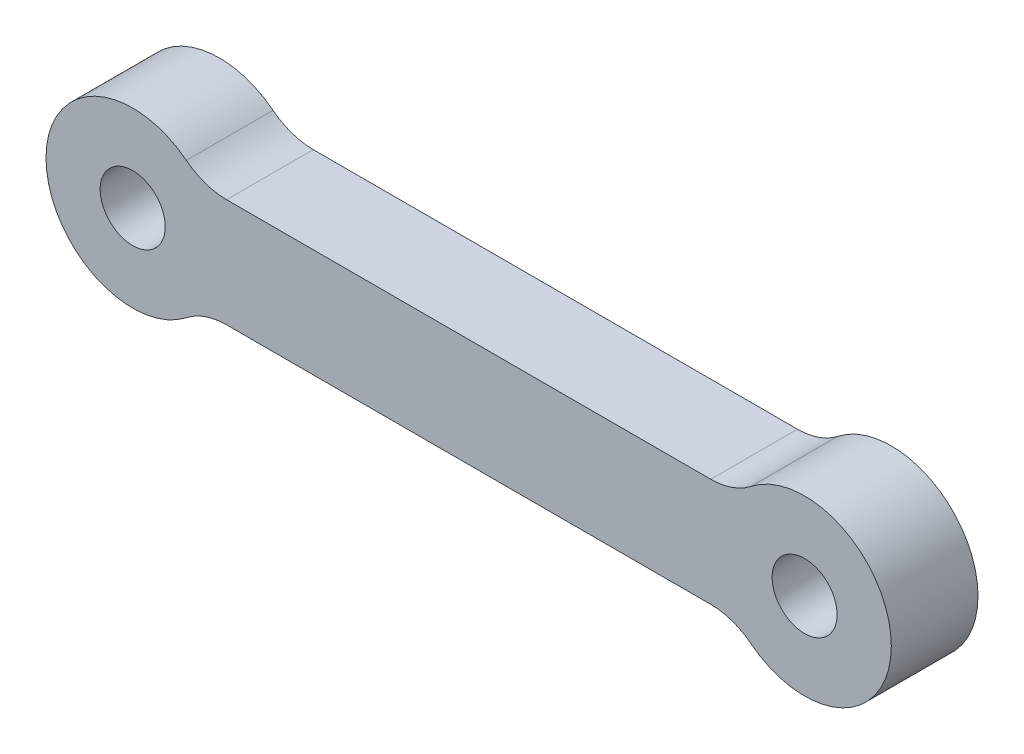
ISO-10303-21;
HEADER;
FILE_DESCRIPTION(('STEP AP214'),'2;1');
FILE_NAME('part.step','',(''),(''),'','','');
FILE_SCHEMA(('AUTOMOTIVE_DESIGN { 1 0 10303 214 1 1 1 1 }'));
ENDSEC;
DATA;
#1=APPLICATION_CONTEXT('core data for automotive mechanical design processes');
#2=APPLICATION_PROTOCOL_DEFINITION('international standard','automotive_design',2000,#1);
#3=PRODUCT_CONTEXT('',#1,'mechanical');
#4=PRODUCT('Part','Part','',(#3));
#5=PRODUCT_RELATED_PRODUCT_CATEGORY('part','',(#4));
#6=PRODUCT_DEFINITION_FORMATION('','',#4);
#7=PRODUCT_DEFINITION_CONTEXT('part definition',#1,'design');
#8=PRODUCT_DEFINITION('design','',#6,#7);
#9=PRODUCT_DEFINITION_SHAPE('','',#8);
#10=(LENGTH_UNIT() NAMED_UNIT(*) SI_UNIT(.MILLI.,.METRE.));
#11=(NAMED_UNIT(*) PLANE_ANGLE_UNIT() SI_UNIT($,.RADIAN.));
#12=(NAMED_UNIT(*) SI_UNIT($,.STERADIAN.) SOLID_ANGLE_UNIT());
#13=UNCERTAINTY_MEASURE_WITH_UNIT(LENGTH_MEASURE(1.E-05),#10,'distance_accuracy_value','');
#14=(GEOMETRIC_REPRESENTATION_CONTEXT(3) GLOBAL_UNCERTAINTY_ASSIGNED_CONTEXT((#13)) GLOBAL_UNIT_ASSIGNED_CONTEXT((#10,
#11,#12)) REPRESENTATION_CONTEXT('',''));
#15=CARTESIAN_POINT('',(0.,0.,0.));
#16=DIRECTION('',(0.,0.,1.));
#17=DIRECTION('',(1.,0.,0.));
#18=AXIS2_PLACEMENT_3D('',#15,#16,#17);
#19=CARTESIAN_POINT('',(11.1698729810778,5.5,4.));
#20=DIRECTION('',(0.,0.,1.));
#21=DIRECTION('',(1.,0.,0.));
#22=AXIS2_PLACEMENT_3D('',#19,#20,#21);
#23=PLANE('',#22);
#24=CARTESIAN_POINT('',(-15.5,0.,4.));
#25=DIRECTION('',(0.,0.,1.));
#26=DIRECTION('',(1.,0.,0.));
#27=AXIS2_PLACEMENT_3D('',#24,#25,#26);
#28=CIRCLE('',#27,1.5);
#29=CARTESIAN_POINT('',(-14.,0.,4.));
#30=VERTEX_POINT('',#29);
#31=EDGE_CURVE('E142',#30,#30,#28,.T.);
#32=ORIENTED_EDGE('',*,*,#31,.F.);
#33=EDGE_LOOP('',(#32));
#34=FACE_BOUND('',#33,.T.);
#35=CARTESIAN_POINT('',(11.1698729810778,5.5,4.));
#36=DIRECTION('',(0.,0.,-1.));
#37=DIRECTION('',(1.,0.,0.));
#38=AXIS2_PLACEMENT_3D('',#35,#36,#37);
#39=CIRCLE('',#38,3.);
#40=CARTESIAN_POINT('',(13.025641703473,3.14285714285714,4.));
#41=VERTEX_POINT('',#40);
#42=CARTESIAN_POINT('',(11.1698729810778,2.5,4.));
#43=VERTEX_POINT('',#42);
#44=EDGE_CURVE('E153',#41,#43,#39,.T.);
#45=ORIENTED_EDGE('',*,*,#44,.T.);
#46=DIRECTION('',(-1.,0.,0.));
#47=VECTOR('',#46,1.);
#48=CARTESIAN_POINT('',(-11.1698729810778,2.5,4.));
#49=LINE('',#48,#47);
#50=CARTESIAN_POINT('',(-11.1698729810778,2.5,4.));
#51=VERTEX_POINT('',#50);
#52=EDGE_CURVE('E101',#43,#51,#49,.T.);
#53=ORIENTED_EDGE('',*,*,#52,.T.);
#54=CARTESIAN_POINT('',(-11.1698729810778,5.5,4.));
#55=DIRECTION('',(0.,0.,-1.));
#56=DIRECTION('',(-1.,0.,0.));
#57=AXIS2_PLACEMENT_3D('',#54,#55,#56);
#58=CIRCLE('',#57,3.);
#59=CARTESIAN_POINT('',(-13.025641703473,3.14285714285714,4.));
#60=VERTEX_POINT('',#59);
#61=EDGE_CURVE('E168',#51,#60,#58,.T.);
#62=ORIENTED_EDGE('',*,*,#61,.T.);
#63=CARTESIAN_POINT('',(-15.5,0.,4.));
#64=DIRECTION('',(0.,0.,1.));
#65=DIRECTION('',(1.,0.,0.));
#66=AXIS2_PLACEMENT_3D('',#63,#64,#65);
#67=CIRCLE('',#66,4.);
#68=CARTESIAN_POINT('',(-13.025641703473,-3.14285714285714,4.));
#69=VERTEX_POINT('',#68);
#70=EDGE_CURVE('E181',#60,#69,#67,.T.);
#71=ORIENTED_EDGE('',*,*,#70,.T.);
#72=CARTESIAN_POINT('',(-11.1698729810778,-5.5,4.));
#73=DIRECTION('',(0.,0.,-1.));
#74=DIRECTION('',(-1.,0.,0.));
#75=AXIS2_PLACEMENT_3D('',#72,#73,#74);
#76=CIRCLE('',#75,3.);
#77=CARTESIAN_POINT('',(-11.1698729810778,-2.5,4.));
#78=VERTEX_POINT('',#77);
#79=EDGE_CURVE('E120',#69,#78,#76,.T.);
#80=ORIENTED_EDGE('',*,*,#79,.T.);
#81=DIRECTION('',(1.,0.,0.));
#82=VECTOR('',#81,1.);
#83=CARTESIAN_POINT('',(-11.1698729810778,-2.5,4.));
#84=LINE('',#83,#82);
#85=CARTESIAN_POINT('',(11.1698729810778,-2.5,4.));
#86=VERTEX_POINT('',#85);
#87=EDGE_CURVE('E114',#78,#86,#84,.T.);
#88=ORIENTED_EDGE('',*,*,#87,.T.);
#89=CARTESIAN_POINT('',(11.1698729810778,-5.5,4.));
#90=DIRECTION('',(0.,0.,-1.));
#91=DIRECTION('',(-1.,0.,0.));
#92=AXIS2_PLACEMENT_3D('',#89,#90,#91);
#93=CIRCLE('',#92,3.);
#94=CARTESIAN_POINT('',(13.025641703473,-3.14285714285714,4.));
#95=VERTEX_POINT('',#94);
#96=EDGE_CURVE('E118',#86,#95,#93,.T.);
#97=ORIENTED_EDGE('',*,*,#96,.T.);
#98=CARTESIAN_POINT('',(15.5,0.,4.));
#99=DIRECTION('',(0.,0.,1.));
#100=DIRECTION('',(-1.,0.,0.));
#101=AXIS2_PLACEMENT_3D('',#98,#99,#100);
#102=CIRCLE('',#101,3.99999999999999);
#103=EDGE_CURVE('E58',#95,#41,#102,.T.);
#104=ORIENTED_EDGE('',*,*,#103,.T.);
#105=EDGE_LOOP('',(#45,#53,#62,#71,#80,#88,#97,#104));
#106=FACE_BOUND('',#105,.T.);
#107=CARTESIAN_POINT('',(15.5,0.,4.));
#108=DIRECTION('',(0.,0.,1.));
#109=DIRECTION('',(-1.,0.,0.));
#110=AXIS2_PLACEMENT_3D('',#107,#108,#109);
#111=CIRCLE('',#110,1.5);
#112=CARTESIAN_POINT('',(14.,0.,4.));
#113=VERTEX_POINT('',#112);
#114=EDGE_CURVE('E190',#113,#113,#111,.T.);
#115=ORIENTED_EDGE('',*,*,#114,.F.);
#116=EDGE_LOOP('',(#115));
#117=FACE_BOUND('',#116,.T.);
#118=ADVANCED_FACE('F41',(#34,#106,#117),#23,.T.);
#119=CARTESIAN_POINT('',(11.1698729810778,5.5,0.));
#120=DIRECTION('',(0.,0.,1.));
#121=DIRECTION('',(1.,0.,0.));
#122=AXIS2_PLACEMENT_3D('',#119,#120,#121);
#123=PLANE('',#122);
#124=CARTESIAN_POINT('',(11.1698729810778,5.5,0.));
#125=DIRECTION('',(0.,0.,-1.));
#126=DIRECTION('',(1.,0.,0.));
#127=AXIS2_PLACEMENT_3D('',#124,#125,#126);
#128=CIRCLE('',#127,3.);
#129=CARTESIAN_POINT('',(13.025641703473,3.14285714285714,0.));
#130=VERTEX_POINT('',#129);
#131=CARTESIAN_POINT('',(11.1698729810778,2.5,0.));
#132=VERTEX_POINT('',#131);
#133=EDGE_CURVE('E138',#130,#132,#128,.T.);
#134=ORIENTED_EDGE('',*,*,#133,.F.);
#135=CARTESIAN_POINT('',(15.5,0.,0.));
#136=DIRECTION('',(0.,0.,1.));
#137=DIRECTION('',(-1.,0.,0.));
#138=AXIS2_PLACEMENT_3D('',#135,#136,#137);
#139=CIRCLE('',#138,3.99999999999999);
#140=CARTESIAN_POINT('',(13.025641703473,-3.14285714285714,0.));
#141=VERTEX_POINT('',#140);
#142=EDGE_CURVE('E93',#141,#130,#139,.T.);
#143=ORIENTED_EDGE('',*,*,#142,.F.);
#144=CARTESIAN_POINT('',(11.1698729810778,-5.5,0.));
#145=DIRECTION('',(0.,0.,-1.));
#146=DIRECTION('',(-1.,0.,0.));
#147=AXIS2_PLACEMENT_3D('',#144,#145,#146);
#148=CIRCLE('',#147,3.);
#149=CARTESIAN_POINT('',(11.1698729810778,-2.5,0.));
#150=VERTEX_POINT('',#149);
#151=EDGE_CURVE('E87',#150,#141,#148,.T.);
#152=ORIENTED_EDGE('',*,*,#151,.F.);
#153=DIRECTION('',(1.,0.,0.));
#154=VECTOR('',#153,1.);
#155=CARTESIAN_POINT('',(-11.1698729810778,-2.5,0.));
#156=LINE('',#155,#154);
#157=CARTESIAN_POINT('',(-11.1698729810778,-2.5,0.));
#158=VERTEX_POINT('',#157);
#159=EDGE_CURVE('E128',#158,#150,#156,.T.);
#160=ORIENTED_EDGE('',*,*,#159,.F.);
#161=CARTESIAN_POINT('',(-11.1698729810778,-5.5,0.));
#162=DIRECTION('',(0.,0.,-1.));
#163=DIRECTION('',(-1.,0.,0.));
#164=AXIS2_PLACEMENT_3D('',#161,#162,#163);
#165=CIRCLE('',#164,3.);
#166=CARTESIAN_POINT('',(-13.025641703473,-3.14285714285714,0.));
#167=VERTEX_POINT('',#166);
#168=EDGE_CURVE('E148',#167,#158,#165,.T.);
#169=ORIENTED_EDGE('',*,*,#168,.F.);
#170=CARTESIAN_POINT('',(-15.5,0.,0.));
#171=DIRECTION('',(0.,0.,1.));
#172=DIRECTION('',(1.,0.,0.));
#173=AXIS2_PLACEMENT_3D('',#170,#171,#172);
#174=CIRCLE('',#173,4.);
#175=CARTESIAN_POINT('',(-13.025641703473,3.14285714285714,0.));
#176=VERTEX_POINT('',#175);
#177=EDGE_CURVE('E146',#176,#167,#174,.T.);
#178=ORIENTED_EDGE('',*,*,#177,.F.);
#179=CARTESIAN_POINT('',(-11.1698729810778,5.5,0.));
#180=DIRECTION('',(0.,0.,-1.));
#181=DIRECTION('',(-1.,0.,0.));
#182=AXIS2_PLACEMENT_3D('',#179,#180,#181);
#183=CIRCLE('',#182,3.);
#184=CARTESIAN_POINT('',(-11.1698729810778,2.5,0.));
#185=VERTEX_POINT('',#184);
#186=EDGE_CURVE('E144',#185,#176,#183,.T.);
#187=ORIENTED_EDGE('',*,*,#186,.F.);
#188=DIRECTION('',(-1.,0.,0.));
#189=VECTOR('',#188,1.);
#190=CARTESIAN_POINT('',(-11.1698729810778,2.5,0.));
#191=LINE('',#190,#189);
#192=EDGE_CURVE('E141',#132,#185,#191,.T.);
#193=ORIENTED_EDGE('',*,*,#192,.F.);
#194=EDGE_LOOP('',(#134,#143,#152,#160,#169,#178,#187,#193));
#195=FACE_BOUND('',#194,.T.);
#196=CARTESIAN_POINT('',(-15.5,0.,0.));
#197=DIRECTION('',(0.,0.,1.));
#198=DIRECTION('',(1.,0.,0.));
#199=AXIS2_PLACEMENT_3D('',#196,#197,#198);
#200=CIRCLE('',#199,1.5);
#201=CARTESIAN_POINT('',(-14.,0.,0.));
#202=VERTEX_POINT('',#201);
#203=EDGE_CURVE('E187',#202,#202,#200,.T.);
#204=ORIENTED_EDGE('',*,*,#203,.T.);
#205=EDGE_LOOP('',(#204));
#206=FACE_BOUND('',#205,.T.);
#207=CARTESIAN_POINT('',(15.5,0.,0.));
#208=DIRECTION('',(0.,0.,1.));
#209=DIRECTION('',(-1.,0.,0.));
#210=AXIS2_PLACEMENT_3D('',#207,#208,#209);
#211=CIRCLE('',#210,1.5);
#212=CARTESIAN_POINT('',(14.,0.,0.));
#213=VERTEX_POINT('',#212);
#214=EDGE_CURVE('E193',#213,#213,#211,.T.);
#215=ORIENTED_EDGE('',*,*,#214,.T.);
#216=EDGE_LOOP('',(#215));
#217=FACE_BOUND('',#216,.T.);
#218=ADVANCED_FACE('F172',(#195,#206,#217),#123,.F.);
#219=CARTESIAN_POINT('',(11.1698729810778,5.5,4.));
#220=DIRECTION('',(0.,0.,-1.));
#221=DIRECTION('',(-1.,0.,0.));
#222=AXIS2_PLACEMENT_3D('',#219,#220,#221);
#223=CYLINDRICAL_SURFACE('',#222,3.);
#224=ORIENTED_EDGE('',*,*,#133,.T.);
#225=DIRECTION('',(0.,0.,-1.));
#226=VECTOR('',#225,1.);
#227=CARTESIAN_POINT('',(11.1698729810778,2.5,4.));
#228=LINE('',#227,#226);
#229=EDGE_CURVE('E11',#43,#132,#228,.T.);
#230=ORIENTED_EDGE('',*,*,#229,.F.);
#231=ORIENTED_EDGE('',*,*,#44,.F.);
#232=DIRECTION('',(0.,0.,-1.));
#233=VECTOR('',#232,1.);
#234=CARTESIAN_POINT('',(13.025641703473,3.14285714285714,4.));
#235=LINE('',#234,#233);
#236=EDGE_CURVE('E134',#41,#130,#235,.T.);
#237=ORIENTED_EDGE('',*,*,#236,.T.);
#238=EDGE_LOOP('',(#224,#230,#231,#237));
#239=FACE_BOUND('',#238,.T.);
#240=ADVANCED_FACE('F43',(#239),#223,.F.);
#241=CARTESIAN_POINT('',(-11.1698729810778,2.5,4.));
#242=DIRECTION('',(0.,-1.,0.));
#243=DIRECTION('',(0.,0.,-1.));
#244=AXIS2_PLACEMENT_3D('',#241,#242,#243);
#245=PLANE('',#244);
#246=ORIENTED_EDGE('',*,*,#192,.T.);
#247=DIRECTION('',(0.,0.,-1.));
#248=VECTOR('',#247,1.);
#249=CARTESIAN_POINT('',(-11.1698729810778,2.5,4.));
#250=LINE('',#249,#248);
#251=EDGE_CURVE('E50',#51,#185,#250,.T.);
#252=ORIENTED_EDGE('',*,*,#251,.F.);
#253=ORIENTED_EDGE('',*,*,#52,.F.);
#254=ORIENTED_EDGE('',*,*,#229,.T.);
#255=EDGE_LOOP('',(#246,#252,#253,#254));
#256=FACE_BOUND('',#255,.T.);
#257=ADVANCED_FACE('F225',(#256),#245,.F.);
#258=CARTESIAN_POINT('',(-11.1698729810778,5.5,4.));
#259=DIRECTION('',(0.,0.,-1.));
#260=DIRECTION('',(-1.,0.,0.));
#261=AXIS2_PLACEMENT_3D('',#258,#259,#260);
#262=CYLINDRICAL_SURFACE('',#261,3.);
#263=ORIENTED_EDGE('',*,*,#186,.T.);
#264=DIRECTION('',(0.,0.,-1.));
#265=VECTOR('',#264,1.);
#266=CARTESIAN_POINT('',(-13.025641703473,3.14285714285714,4.));
#267=LINE('',#266,#265);
#268=EDGE_CURVE('E160',#60,#176,#267,.T.);
#269=ORIENTED_EDGE('',*,*,#268,.F.);
#270=ORIENTED_EDGE('',*,*,#61,.F.);
#271=ORIENTED_EDGE('',*,*,#251,.T.);
#272=EDGE_LOOP('',(#263,#269,#270,#271));
#273=FACE_BOUND('',#272,.T.);
#274=ADVANCED_FACE('F166',(#273),#262,.F.);
#275=CARTESIAN_POINT('',(-15.5,0.,4.));
#276=DIRECTION('',(0.,0.,-1.));
#277=DIRECTION('',(-1.,0.,0.));
#278=AXIS2_PLACEMENT_3D('',#275,#276,#277);
#279=CYLINDRICAL_SURFACE('',#278,4.);
#280=ORIENTED_EDGE('',*,*,#177,.T.);
#281=DIRECTION('',(0.,0.,-1.));
#282=VECTOR('',#281,1.);
#283=CARTESIAN_POINT('',(-13.025641703473,-3.14285714285714,4.));
#284=LINE('',#283,#282);
#285=EDGE_CURVE('E157',#69,#167,#284,.T.);
#286=ORIENTED_EDGE('',*,*,#285,.F.);
#287=ORIENTED_EDGE('',*,*,#70,.F.);
#288=ORIENTED_EDGE('',*,*,#268,.T.);
#289=EDGE_LOOP('',(#280,#286,#287,#288));
#290=FACE_BOUND('',#289,.T.);
#291=ADVANCED_FACE('F177',(#290),#279,.T.);
#292=CARTESIAN_POINT('',(-11.1698729810778,-5.5,4.));
#293=DIRECTION('',(0.,0.,-1.));
#294=DIRECTION('',(-1.,0.,0.));
#295=AXIS2_PLACEMENT_3D('',#292,#293,#294);
#296=CYLINDRICAL_SURFACE('',#295,3.);
#297=ORIENTED_EDGE('',*,*,#168,.T.);
#298=DIRECTION('',(0.,0.,-1.));
#299=VECTOR('',#298,1.);
#300=CARTESIAN_POINT('',(-11.1698729810778,-2.5,4.));
#301=LINE('',#300,#299);
#302=EDGE_CURVE('E129',#78,#158,#301,.T.);
#303=ORIENTED_EDGE('',*,*,#302,.F.);
#304=ORIENTED_EDGE('',*,*,#79,.F.);
#305=ORIENTED_EDGE('',*,*,#285,.T.);
#306=EDGE_LOOP('',(#297,#303,#304,#305));
#307=FACE_BOUND('',#306,.T.);
#308=ADVANCED_FACE('F180',(#307),#296,.F.);
#309=CARTESIAN_POINT('',(-11.1698729810778,-2.5,4.));
#310=DIRECTION('',(0.,1.,0.));
#311=DIRECTION('',(0.,0.,1.));
#312=AXIS2_PLACEMENT_3D('',#309,#310,#311);
#313=PLANE('',#312);
#314=ORIENTED_EDGE('',*,*,#159,.T.);
#315=DIRECTION('',(0.,0.,-1.));
#316=VECTOR('',#315,1.);
#317=CARTESIAN_POINT('',(11.1698729810778,-2.5,4.));
#318=LINE('',#317,#316);
#319=EDGE_CURVE('E125',#86,#150,#318,.T.);
#320=ORIENTED_EDGE('',*,*,#319,.F.);
#321=ORIENTED_EDGE('',*,*,#87,.F.);
#322=ORIENTED_EDGE('',*,*,#302,.T.);
#323=EDGE_LOOP('',(#314,#320,#321,#322));
#324=FACE_BOUND('',#323,.T.);
#325=ADVANCED_FACE('F126',(#324),#313,.F.);
#326=CARTESIAN_POINT('',(11.1698729810778,-5.5,4.));
#327=DIRECTION('',(0.,0.,-1.));
#328=DIRECTION('',(-1.,0.,0.));
#329=AXIS2_PLACEMENT_3D('',#326,#327,#328);
#330=CYLINDRICAL_SURFACE('',#329,3.);
#331=ORIENTED_EDGE('',*,*,#151,.T.);
#332=DIRECTION('',(0.,0.,-1.));
#333=VECTOR('',#332,1.);
#334=CARTESIAN_POINT('',(13.025641703473,-3.14285714285714,4.));
#335=LINE('',#334,#333);
#336=EDGE_CURVE('E130',#95,#141,#335,.T.);
#337=ORIENTED_EDGE('',*,*,#336,.F.);
#338=ORIENTED_EDGE('',*,*,#96,.F.);
#339=ORIENTED_EDGE('',*,*,#319,.T.);
#340=EDGE_LOOP('',(#331,#337,#338,#339));
#341=FACE_BOUND('',#340,.T.);
#342=ADVANCED_FACE('F132',(#341),#330,.F.);
#343=CARTESIAN_POINT('',(15.5,0.,4.));
#344=DIRECTION('',(0.,0.,-1.));
#345=DIRECTION('',(-1.,0.,0.));
#346=AXIS2_PLACEMENT_3D('',#343,#344,#345);
#347=CYLINDRICAL_SURFACE('',#346,3.99999999999999);
#348=ORIENTED_EDGE('',*,*,#142,.T.);
#349=ORIENTED_EDGE('',*,*,#236,.F.);
#350=ORIENTED_EDGE('',*,*,#103,.F.);
#351=ORIENTED_EDGE('',*,*,#336,.T.);
#352=EDGE_LOOP('',(#348,#349,#350,#351));
#353=FACE_BOUND('',#352,.T.);
#354=ADVANCED_FACE('F213',(#353),#347,.T.);
#355=CARTESIAN_POINT('',(-15.5,0.,4.));
#356=DIRECTION('',(0.,0.,-1.));
#357=DIRECTION('',(-1.,0.,0.));
#358=AXIS2_PLACEMENT_3D('',#355,#356,#357);
#359=CYLINDRICAL_SURFACE('',#358,1.5);
#360=ORIENTED_EDGE('',*,*,#31,.T.);
#361=EDGE_LOOP('',(#360));
#362=FACE_BOUND('',#361,.T.);
#363=ORIENTED_EDGE('',*,*,#203,.F.);
#364=EDGE_LOOP('',(#363));
#365=FACE_BOUND('',#364,.T.);
#366=ADVANCED_FACE('F210',(#362,#365),#359,.F.);
#367=CARTESIAN_POINT('',(15.5,0.,4.));
#368=DIRECTION('',(0.,0.,-1.));
#369=DIRECTION('',(-1.,0.,0.));
#370=AXIS2_PLACEMENT_3D('',#367,#368,#369);
#371=CYLINDRICAL_SURFACE('',#370,1.5);
#372=ORIENTED_EDGE('',*,*,#114,.T.);
#373=EDGE_LOOP('',(#372));
#374=FACE_BOUND('',#373,.T.);
#375=ORIENTED_EDGE('',*,*,#214,.F.);
#376=EDGE_LOOP('',(#375));
#377=FACE_BOUND('',#376,.T.);
#378=ADVANCED_FACE('F199',(#374,#377),#371,.F.);
#379=CLOSED_SHELL('',(#118,#218,#240,#257,#274,#291,#308,#325,#342,#354,#366,#378));
#380=MANIFOLD_SOLID_BREP('B2',#379);
#381=ADVANCED_BREP_SHAPE_REPRESENTATION('',(#18,#380),#14);
#382=SHAPE_DEFINITION_REPRESENTATION(#9,#381);
ENDSEC;
END-ISO-10303-21;
